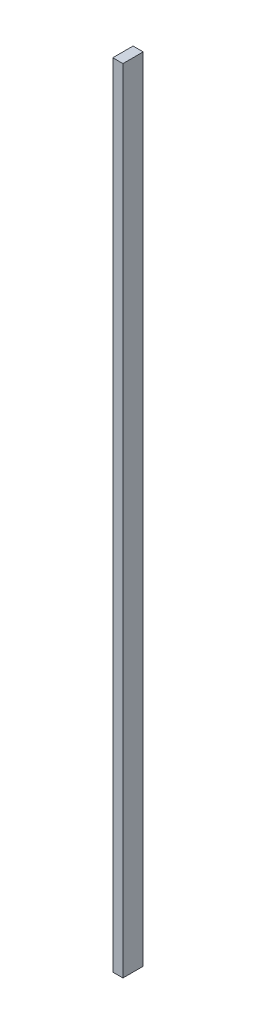
ISO-10303-21;
HEADER;
FILE_DESCRIPTION(('STEP AP214'),'2;1');
FILE_NAME('part.step','',(''),(''),'','','');
FILE_SCHEMA(('AUTOMOTIVE_DESIGN { 1 0 10303 214 1 1 1 1 }'));
ENDSEC;
DATA;
#1=APPLICATION_CONTEXT('core data for automotive mechanical design processes');
#2=APPLICATION_PROTOCOL_DEFINITION('international standard','automotive_design',2000,#1);
#3=PRODUCT_CONTEXT('',#1,'mechanical');
#4=PRODUCT('Part','Part','',(#3));
#5=PRODUCT_RELATED_PRODUCT_CATEGORY('part','',(#4));
#6=PRODUCT_DEFINITION_FORMATION('','',#4);
#7=PRODUCT_DEFINITION_CONTEXT('part definition',#1,'design');
#8=PRODUCT_DEFINITION('design','',#6,#7);
#9=PRODUCT_DEFINITION_SHAPE('','',#8);
#10=(LENGTH_UNIT() NAMED_UNIT(*) SI_UNIT(.MILLI.,.METRE.));
#11=(NAMED_UNIT(*) PLANE_ANGLE_UNIT() SI_UNIT($,.RADIAN.));
#12=(NAMED_UNIT(*) SI_UNIT($,.STERADIAN.) SOLID_ANGLE_UNIT());
#13=UNCERTAINTY_MEASURE_WITH_UNIT(LENGTH_MEASURE(1.E-05),#10,'distance_accuracy_value','');
#14=(GEOMETRIC_REPRESENTATION_CONTEXT(3) GLOBAL_UNCERTAINTY_ASSIGNED_CONTEXT((#13)) GLOBAL_UNIT_ASSIGNED_CONTEXT((#10,
#11,#12)) REPRESENTATION_CONTEXT('',''));
#15=CARTESIAN_POINT('',(0.,0.,0.));
#16=DIRECTION('',(0.,0.,1.));
#17=DIRECTION('',(1.,0.,0.));
#18=AXIS2_PLACEMENT_3D('',#15,#16,#17);
#19=CARTESIAN_POINT('',(-12.5,1950.,-25.));
#20=DIRECTION('',(1.,0.,0.));
#21=DIRECTION('',(0.,0.,-1.));
#22=AXIS2_PLACEMENT_3D('',#19,#20,#21);
#23=PLANE('',#22);
#24=DIRECTION('',(0.,0.,1.));
#25=VECTOR('',#24,1.);
#26=CARTESIAN_POINT('',(-12.5,0.,-25.));
#27=LINE('',#26,#25);
#28=CARTESIAN_POINT('',(-12.5,0.,-25.));
#29=VERTEX_POINT('',#28);
#30=CARTESIAN_POINT('',(-12.5,0.,25.));
#31=VERTEX_POINT('',#30);
#32=EDGE_CURVE('E111',#29,#31,#27,.T.);
#33=ORIENTED_EDGE('',*,*,#32,.T.);
#34=DIRECTION('',(0.,-1.,0.));
#35=VECTOR('',#34,1.);
#36=CARTESIAN_POINT('',(-12.5,1950.,25.));
#37=LINE('',#36,#35);
#38=CARTESIAN_POINT('',(-12.5,1950.,25.));
#39=VERTEX_POINT('',#38);
#40=EDGE_CURVE('E11',#39,#31,#37,.T.);
#41=ORIENTED_EDGE('',*,*,#40,.F.);
#42=DIRECTION('',(0.,0.,1.));
#43=VECTOR('',#42,1.);
#44=CARTESIAN_POINT('',(-12.5,1950.,-25.));
#45=LINE('',#44,#43);
#46=CARTESIAN_POINT('',(-12.5,1950.,-25.));
#47=VERTEX_POINT('',#46);
#48=EDGE_CURVE('E95',#47,#39,#45,.T.);
#49=ORIENTED_EDGE('',*,*,#48,.F.);
#50=DIRECTION('',(0.,-1.,0.));
#51=VECTOR('',#50,1.);
#52=CARTESIAN_POINT('',(-12.5,1950.,-25.));
#53=LINE('',#52,#51);
#54=EDGE_CURVE('E107',#47,#29,#53,.T.);
#55=ORIENTED_EDGE('',*,*,#54,.T.);
#56=EDGE_LOOP('',(#33,#41,#49,#55));
#57=FACE_BOUND('',#56,.T.);
#58=ADVANCED_FACE('F43',(#57),#23,.F.);
#59=CARTESIAN_POINT('',(12.5,1950.,25.));
#60=DIRECTION('',(0.,0.,-1.));
#61=DIRECTION('',(-1.,0.,0.));
#62=AXIS2_PLACEMENT_3D('',#59,#60,#61);
#63=PLANE('',#62);
#64=DIRECTION('',(1.,0.,0.));
#65=VECTOR('',#64,1.);
#66=CARTESIAN_POINT('',(12.5,0.,25.));
#67=LINE('',#66,#65);
#68=CARTESIAN_POINT('',(12.5,0.,25.));
#69=VERTEX_POINT('',#68);
#70=EDGE_CURVE('E100',#31,#69,#67,.T.);
#71=ORIENTED_EDGE('',*,*,#70,.T.);
#72=DIRECTION('',(0.,-1.,0.));
#73=VECTOR('',#72,1.);
#74=CARTESIAN_POINT('',(12.5,1950.,25.));
#75=LINE('',#74,#73);
#76=CARTESIAN_POINT('',(12.5,1950.,25.));
#77=VERTEX_POINT('',#76);
#78=EDGE_CURVE('E52',#77,#69,#75,.T.);
#79=ORIENTED_EDGE('',*,*,#78,.F.);
#80=DIRECTION('',(1.,0.,0.));
#81=VECTOR('',#80,1.);
#82=CARTESIAN_POINT('',(12.5,1950.,25.));
#83=LINE('',#82,#81);
#84=EDGE_CURVE('E90',#39,#77,#83,.T.);
#85=ORIENTED_EDGE('',*,*,#84,.F.);
#86=ORIENTED_EDGE('',*,*,#40,.T.);
#87=EDGE_LOOP('',(#71,#79,#85,#86));
#88=FACE_BOUND('',#87,.T.);
#89=ADVANCED_FACE('F99',(#88),#63,.F.);
#90=CARTESIAN_POINT('',(12.5,1950.,-25.));
#91=DIRECTION('',(-1.,0.,0.));
#92=DIRECTION('',(0.,0.,1.));
#93=AXIS2_PLACEMENT_3D('',#90,#91,#92);
#94=PLANE('',#93);
#95=DIRECTION('',(0.,0.,-1.));
#96=VECTOR('',#95,1.);
#97=CARTESIAN_POINT('',(12.5,0.,-25.));
#98=LINE('',#97,#96);
#99=CARTESIAN_POINT('',(12.5,0.,-25.));
#100=VERTEX_POINT('',#99);
#101=EDGE_CURVE('E77',#69,#100,#98,.T.);
#102=ORIENTED_EDGE('',*,*,#101,.T.);
#103=DIRECTION('',(0.,-1.,0.));
#104=VECTOR('',#103,1.);
#105=CARTESIAN_POINT('',(12.5,1950.,-25.));
#106=LINE('',#105,#104);
#107=CARTESIAN_POINT('',(12.5,1950.,-25.));
#108=VERTEX_POINT('',#107);
#109=EDGE_CURVE('E102',#108,#100,#106,.T.);
#110=ORIENTED_EDGE('',*,*,#109,.F.);
#111=DIRECTION('',(0.,0.,-1.));
#112=VECTOR('',#111,1.);
#113=CARTESIAN_POINT('',(12.5,1950.,-25.));
#114=LINE('',#113,#112);
#115=EDGE_CURVE('E93',#77,#108,#114,.T.);
#116=ORIENTED_EDGE('',*,*,#115,.F.);
#117=ORIENTED_EDGE('',*,*,#78,.T.);
#118=EDGE_LOOP('',(#102,#110,#116,#117));
#119=FACE_BOUND('',#118,.T.);
#120=ADVANCED_FACE('F103',(#119),#94,.F.);
#121=CARTESIAN_POINT('',(12.5,1950.,-25.));
#122=DIRECTION('',(0.,0.,1.));
#123=DIRECTION('',(1.,0.,0.));
#124=AXIS2_PLACEMENT_3D('',#121,#122,#123);
#125=PLANE('',#124);
#126=DIRECTION('',(-1.,0.,0.));
#127=VECTOR('',#126,1.);
#128=CARTESIAN_POINT('',(12.5,0.,-25.));
#129=LINE('',#128,#127);
#130=EDGE_CURVE('E83',#100,#29,#129,.T.);
#131=ORIENTED_EDGE('',*,*,#130,.T.);
#132=ORIENTED_EDGE('',*,*,#54,.F.);
#133=DIRECTION('',(-1.,0.,0.));
#134=VECTOR('',#133,1.);
#135=CARTESIAN_POINT('',(12.5,1950.,-25.));
#136=LINE('',#135,#134);
#137=EDGE_CURVE('E60',#108,#47,#136,.T.);
#138=ORIENTED_EDGE('',*,*,#137,.F.);
#139=ORIENTED_EDGE('',*,*,#109,.T.);
#140=EDGE_LOOP('',(#131,#132,#138,#139));
#141=FACE_BOUND('',#140,.T.);
#142=ADVANCED_FACE('F124',(#141),#125,.F.);
#143=CARTESIAN_POINT('',(0.,1950.,0.));
#144=DIRECTION('',(0.,-1.,0.));
#145=DIRECTION('',(0.,0.,-1.));
#146=AXIS2_PLACEMENT_3D('',#143,#144,#145);
#147=PLANE('',#146);
#148=ORIENTED_EDGE('',*,*,#48,.T.);
#149=ORIENTED_EDGE('',*,*,#84,.T.);
#150=ORIENTED_EDGE('',*,*,#115,.T.);
#151=ORIENTED_EDGE('',*,*,#137,.T.);
#152=EDGE_LOOP('',(#148,#149,#150,#151));
#153=FACE_BOUND('',#152,.T.);
#154=ADVANCED_FACE('F91',(#153),#147,.F.);
#155=CARTESIAN_POINT('',(0.,0.,0.));
#156=DIRECTION('',(0.,-1.,0.));
#157=DIRECTION('',(0.,0.,-1.));
#158=AXIS2_PLACEMENT_3D('',#155,#156,#157);
#159=PLANE('',#158);
#160=ORIENTED_EDGE('',*,*,#32,.F.);
#161=ORIENTED_EDGE('',*,*,#130,.F.);
#162=ORIENTED_EDGE('',*,*,#101,.F.);
#163=ORIENTED_EDGE('',*,*,#70,.F.);
#164=EDGE_LOOP('',(#160,#161,#162,#163));
#165=FACE_BOUND('',#164,.T.);
#166=ADVANCED_FACE('F127',(#165),#159,.T.);
#167=CLOSED_SHELL('',(#58,#89,#120,#142,#154,#166));
#168=MANIFOLD_SOLID_BREP('B2',#167);
#169=ADVANCED_BREP_SHAPE_REPRESENTATION('',(#18,#168),#14);
#170=SHAPE_DEFINITION_REPRESENTATION(#9,#169);
ENDSEC;
END-ISO-10303-21;
